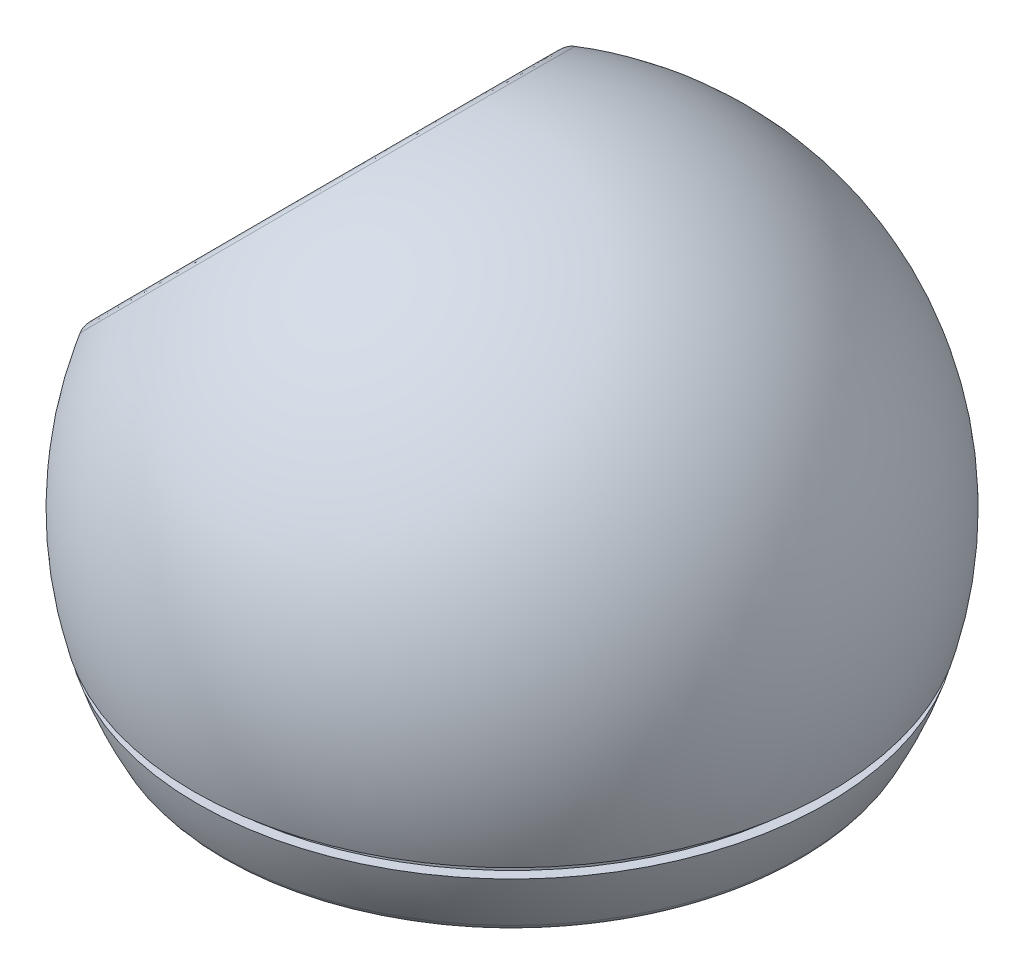
ISO-10303-21;
HEADER;
FILE_DESCRIPTION(('STEP AP214'),'2;1');
FILE_NAME('part.step','',(''),(''),'','','');
FILE_SCHEMA(('AUTOMOTIVE_DESIGN { 1 0 10303 214 1 1 1 1 }'));
ENDSEC;
DATA;
#1=APPLICATION_CONTEXT('core data for automotive mechanical design processes');
#2=APPLICATION_PROTOCOL_DEFINITION('international standard','automotive_design',2000,#1);
#3=PRODUCT_CONTEXT('',#1,'mechanical');
#4=PRODUCT('Part','Part','',(#3));
#5=PRODUCT_RELATED_PRODUCT_CATEGORY('part','',(#4));
#6=PRODUCT_DEFINITION_FORMATION('','',#4);
#7=PRODUCT_DEFINITION_CONTEXT('part definition',#1,'design');
#8=PRODUCT_DEFINITION('design','',#6,#7);
#9=PRODUCT_DEFINITION_SHAPE('','',#8);
#10=(LENGTH_UNIT() NAMED_UNIT(*) SI_UNIT(.MILLI.,.METRE.));
#11=(NAMED_UNIT(*) PLANE_ANGLE_UNIT() SI_UNIT($,.RADIAN.));
#12=(NAMED_UNIT(*) SI_UNIT($,.STERADIAN.) SOLID_ANGLE_UNIT());
#13=UNCERTAINTY_MEASURE_WITH_UNIT(LENGTH_MEASURE(1.E-05),#10,'distance_accuracy_value','');
#14=(GEOMETRIC_REPRESENTATION_CONTEXT(3) GLOBAL_UNCERTAINTY_ASSIGNED_CONTEXT((#13)) GLOBAL_UNIT_ASSIGNED_CONTEXT((#10,
#11,#12)) REPRESENTATION_CONTEXT('',''));
#15=CARTESIAN_POINT('',(0.,0.,0.));
#16=DIRECTION('',(0.,0.,1.));
#17=DIRECTION('',(1.,0.,0.));
#18=AXIS2_PLACEMENT_3D('',#15,#16,#17);
#19=CARTESIAN_POINT('',(0.,0.,0.));
#20=DIRECTION('',(0.,-1.,0.));
#21=DIRECTION('',(0.,0.,1.));
#22=AXIS2_PLACEMENT_3D('',#19,#20,#21);
#23=SPHERICAL_SURFACE('',#22,40.);
#24=CARTESIAN_POINT('',(-22.3808982234212,22.2782335526715,0.));
#25=DIRECTION('',(0.708730441300506,-0.705479384230319,0.));
#26=DIRECTION('',(0.705479384230319,0.708730441300506,0.));
#27=AXIS2_PLACEMENT_3D('',#24,#25,#26);
#28=CIRCLE('',#27,24.5514908811152);
#29=CARTESIAN_POINT('',(-5.06032755467576,39.6786225194296,0.));
#30=VERTEX_POINT('',#29);
#31=EDGE_CURVE('E282',#30,#30,#28,.T.);
#32=ORIENTED_EDGE('',*,*,#31,.T.);
#33=EDGE_LOOP('',(#32));
#34=FACE_BOUND('',#33,.T.);
#35=CARTESIAN_POINT('',(0.,-10.5,0.));
#36=DIRECTION('',(0.,-1.,0.));
#37=DIRECTION('',(0.,0.,-1.));
#38=AXIS2_PLACEMENT_3D('',#35,#36,#37);
#39=CIRCLE('',#38,38.5972796968906);
#40=CARTESIAN_POINT('',(0.,-10.5,-38.5972796968906));
#41=VERTEX_POINT('',#40);
#42=EDGE_CURVE('E304',#41,#41,#39,.T.);
#43=ORIENTED_EDGE('',*,*,#42,.F.);
#44=EDGE_LOOP('',(#43));
#45=FACE_BOUND('',#44,.T.);
#46=ADVANCED_FACE('F42',(#34,#45),#23,.T.);
#47=CARTESIAN_POINT('',(-40.2644016037276,4.90915596545674,-40.));
#48=DIRECTION('',(0.708730441300506,-0.705479384230319,0.));
#49=DIRECTION('',(0.705479384230319,0.708730441300506,0.));
#50=AXIS2_PLACEMENT_3D('',#47,#48,#49);
#51=PLANE('',#50);
#52=CARTESIAN_POINT('',(-22.6793141948512,22.5752806434986,0.));
#53=DIRECTION('',(0.708730441300506,-0.705479384230319,0.));
#54=DIRECTION('',(0.705479384230319,0.708730441300506,0.));
#55=AXIS2_PLACEMENT_3D('',#52,#53,#54);
#56=CIRCLE('',#55,23.3239163370594);
#57=CARTESIAN_POINT('',(-6.224772059543,39.1056501619188,0.));
#58=VERTEX_POINT('',#57);
#59=EDGE_CURVE('E298',#58,#58,#56,.F.);
#60=ORIENTED_EDGE('',*,*,#59,.T.);
#61=EDGE_LOOP('',(#60));
#62=FACE_BOUND('',#61,.T.);
#63=CARTESIAN_POINT('',(-36.7889018794576,8.40067181748844,-6.));
#64=DIRECTION('',(-0.708730441300506,0.705479384230319,0.));
#65=DIRECTION('',(-0.705479384230319,-0.708730441300506,0.));
#66=AXIS2_PLACEMENT_3D('',#63,#64,#65);
#67=CIRCLE('',#66,1.);
#68=CARTESIAN_POINT('',(-37.4943812636879,7.69194137618793,-6.));
#69=VERTEX_POINT('',#68);
#70=EDGE_CURVE('E307',#69,#69,#67,.T.);
#71=ORIENTED_EDGE('',*,*,#70,.F.);
#72=EDGE_LOOP('',(#71));
#73=FACE_BOUND('',#72,.T.);
#74=CARTESIAN_POINT('',(-36.7889018794575,8.40067181748845,-3.));
#75=DIRECTION('',(-0.708730441300506,0.705479384230319,0.));
#76=DIRECTION('',(-0.705479384230319,-0.708730441300506,0.));
#77=AXIS2_PLACEMENT_3D('',#74,#75,#76);
#78=CIRCLE('',#77,1.);
#79=CARTESIAN_POINT('',(-37.4943812636879,7.69194137618795,-3.));
#80=VERTEX_POINT('',#79);
#81=EDGE_CURVE('E361',#80,#80,#78,.T.);
#82=ORIENTED_EDGE('',*,*,#81,.F.);
#83=EDGE_LOOP('',(#82));
#84=FACE_BOUND('',#83,.T.);
#85=CARTESIAN_POINT('',(-36.7889018794575,8.40067181748847,6.));
#86=DIRECTION('',(-0.708730441300506,0.705479384230319,0.));
#87=DIRECTION('',(-0.705479384230319,-0.708730441300506,0.));
#88=AXIS2_PLACEMENT_3D('',#85,#86,#87);
#89=CIRCLE('',#88,1.);
#90=CARTESIAN_POINT('',(-37.4943812636878,7.69194137618796,6.));
#91=VERTEX_POINT('',#90);
#92=EDGE_CURVE('E365',#91,#91,#89,.T.);
#93=ORIENTED_EDGE('',*,*,#92,.F.);
#94=EDGE_LOOP('',(#93));
#95=FACE_BOUND('',#94,.T.);
#96=CARTESIAN_POINT('',(-36.7889018794575,8.40067181748847,3.));
#97=DIRECTION('',(-0.708730441300506,0.705479384230319,0.));
#98=DIRECTION('',(-0.705479384230319,-0.708730441300506,0.));
#99=AXIS2_PLACEMENT_3D('',#96,#97,#98);
#100=CIRCLE('',#99,1.);
#101=CARTESIAN_POINT('',(-37.4943812636878,7.69194137618796,3.));
#102=VERTEX_POINT('',#101);
#103=EDGE_CURVE('E369',#102,#102,#100,.T.);
#104=ORIENTED_EDGE('',*,*,#103,.F.);
#105=EDGE_LOOP('',(#104));
#106=FACE_BOUND('',#105,.T.);
#107=CARTESIAN_POINT('',(-36.7889018794575,8.40067181748847,0.));
#108=DIRECTION('',(-0.708730441300506,0.705479384230319,0.));
#109=DIRECTION('',(-0.705479384230319,-0.708730441300506,0.));
#110=AXIS2_PLACEMENT_3D('',#107,#108,#109);
#111=CIRCLE('',#110,1.);
#112=CARTESIAN_POINT('',(-37.4943812636878,7.69194137618796,0.));
#113=VERTEX_POINT('',#112);
#114=EDGE_CURVE('E188',#113,#113,#111,.T.);
#115=ORIENTED_EDGE('',*,*,#114,.F.);
#116=EDGE_LOOP('',(#115));
#117=FACE_BOUND('',#116,.T.);
#118=DIRECTION('',(0.,0.,-1.));
#119=VECTOR('',#118,1.);
#120=CARTESIAN_POINT('',(-10.5450687860897,34.7654442338673,-9.19999999999996));
#121=LINE('',#120,#119);
#122=CARTESIAN_POINT('',(-10.5450687860897,34.7654442338673,9.19999999999996));
#123=VERTEX_POINT('',#122);
#124=CARTESIAN_POINT('',(-10.5450687860897,34.7654442338673,-9.19999999999996));
#125=VERTEX_POINT('',#124);
#126=EDGE_CURVE('E260',#123,#125,#121,.T.);
#127=ORIENTED_EDGE('',*,*,#126,.F.);
#128=CARTESIAN_POINT('',(-14.7779450914716,30.5130615860642,9.2));
#129=DIRECTION('',(-0.708730441300506,0.705479384230319,0.));
#130=DIRECTION('',(0.705479384230319,0.708730441300506,0.));
#131=AXIS2_PLACEMENT_3D('',#128,#129,#130);
#132=CIRCLE('',#131,6.);
#133=CARTESIAN_POINT('',(-14.7779450914716,30.5130615860642,15.2));
#134=VERTEX_POINT('',#133);
#135=EDGE_CURVE('E57',#134,#123,#132,.T.);
#136=ORIENTED_EDGE('',*,*,#135,.F.);
#137=DIRECTION('',(0.705479384230319,0.708730441300506,0.));
#138=VECTOR('',#137,1.);
#139=CARTESIAN_POINT('',(-14.7779450914716,30.5130615860642,15.2));
#140=LINE('',#139,#138);
#141=CARTESIAN_POINT('',(-30.5806832982307,14.6374997009329,15.2));
#142=VERTEX_POINT('',#141);
#143=EDGE_CURVE('E237',#142,#134,#140,.T.);
#144=ORIENTED_EDGE('',*,*,#143,.F.);
#145=CARTESIAN_POINT('',(-30.5806832982307,14.6374997009329,9.2));
#146=DIRECTION('',(-0.708730441300506,0.705479384230319,0.));
#147=DIRECTION('',(-0.705479384230319,-0.708730441300506,0.));
#148=AXIS2_PLACEMENT_3D('',#145,#146,#147);
#149=CIRCLE('',#148,6.);
#150=CARTESIAN_POINT('',(-34.8135596036126,10.3851170531299,9.19999999999996));
#151=VERTEX_POINT('',#150);
#152=EDGE_CURVE('E275',#151,#142,#149,.T.);
#153=ORIENTED_EDGE('',*,*,#152,.F.);
#154=DIRECTION('',(0.,0.,1.));
#155=VECTOR('',#154,1.);
#156=CARTESIAN_POINT('',(-34.8135596036126,10.3851170531299,-9.19999999999997));
#157=LINE('',#156,#155);
#158=CARTESIAN_POINT('',(-34.8135596036126,10.3851170531299,-9.2));
#159=VERTEX_POINT('',#158);
#160=EDGE_CURVE('E272',#159,#151,#157,.T.);
#161=ORIENTED_EDGE('',*,*,#160,.F.);
#162=CARTESIAN_POINT('',(-30.5806832982307,14.6374997009329,-9.2));
#163=DIRECTION('',(-0.708730441300506,0.705479384230319,0.));
#164=DIRECTION('',(-0.705479384230319,-0.708730441300506,0.));
#165=AXIS2_PLACEMENT_3D('',#162,#163,#164);
#166=CIRCLE('',#165,6.);
#167=CARTESIAN_POINT('',(-30.5806832982307,14.637499700933,-15.2));
#168=VERTEX_POINT('',#167);
#169=EDGE_CURVE('E269',#168,#159,#166,.T.);
#170=ORIENTED_EDGE('',*,*,#169,.F.);
#171=DIRECTION('',(-0.705479384230319,-0.708730441300506,0.));
#172=VECTOR('',#171,1.);
#173=CARTESIAN_POINT('',(-14.7779450914716,30.5130615860642,-15.2));
#174=LINE('',#173,#172);
#175=CARTESIAN_POINT('',(-14.7779450914716,30.5130615860642,-15.2));
#176=VERTEX_POINT('',#175);
#177=EDGE_CURVE('E266',#176,#168,#174,.T.);
#178=ORIENTED_EDGE('',*,*,#177,.F.);
#179=CARTESIAN_POINT('',(-14.7779450914716,30.5130615860642,-9.2));
#180=DIRECTION('',(-0.708730441300506,0.705479384230319,0.));
#181=DIRECTION('',(-0.705479384230319,-0.708730441300506,0.));
#182=AXIS2_PLACEMENT_3D('',#179,#180,#181);
#183=CIRCLE('',#182,6.);
#184=EDGE_CURVE('E263',#125,#176,#183,.T.);
#185=ORIENTED_EDGE('',*,*,#184,.F.);
#186=EDGE_LOOP('',(#127,#136,#144,#153,#161,#170,#178,#185));
#187=FACE_BOUND('',#186,.T.);
#188=ADVANCED_FACE('F324',(#62,#73,#84,#95,#106,#117,#187),#51,.F.);
#189=CARTESIAN_POINT('',(-14.0692146501711,29.8075822018339,9.2));
#190=DIRECTION('',(-0.708730441300506,0.705479384230319,0.));
#191=DIRECTION('',(-0.705479384230319,-0.708730441300506,0.));
#192=AXIS2_PLACEMENT_3D('',#189,#190,#191);
#193=CYLINDRICAL_SURFACE('',#192,6.);
#194=ORIENTED_EDGE('',*,*,#135,.T.);
#195=DIRECTION('',(-0.708730441300506,0.705479384230319,0.));
#196=VECTOR('',#195,1.);
#197=CARTESIAN_POINT('',(-9.83633834478917,34.059964849637,9.19999999999996));
#198=LINE('',#197,#196);
#199=CARTESIAN_POINT('',(-9.83633834478917,34.059964849637,9.19999999999996));
#200=VERTEX_POINT('',#199);
#201=EDGE_CURVE('E258',#200,#123,#198,.T.);
#202=ORIENTED_EDGE('',*,*,#201,.F.);
#203=CARTESIAN_POINT('',(-14.0692146501711,29.8075822018339,9.2));
#204=DIRECTION('',(-0.708730441300506,0.705479384230319,0.));
#205=DIRECTION('',(0.705479384230319,0.708730441300506,0.));
#206=AXIS2_PLACEMENT_3D('',#203,#204,#205);
#207=CIRCLE('',#206,6.);
#208=CARTESIAN_POINT('',(-14.0692146501711,29.8075822018339,15.2));
#209=VERTEX_POINT('',#208);
#210=EDGE_CURVE('E233',#209,#200,#207,.T.);
#211=ORIENTED_EDGE('',*,*,#210,.F.);
#212=DIRECTION('',(-0.708730441300506,0.705479384230319,0.));
#213=VECTOR('',#212,1.);
#214=CARTESIAN_POINT('',(-14.0692146501711,29.8075822018339,15.2));
#215=LINE('',#214,#213);
#216=EDGE_CURVE('E280',#209,#134,#215,.T.);
#217=ORIENTED_EDGE('',*,*,#216,.T.);
#218=EDGE_LOOP('',(#194,#202,#211,#217));
#219=FACE_BOUND('',#218,.T.);
#220=ADVANCED_FACE('F329',(#219),#193,.F.);
#221=CARTESIAN_POINT('',(-14.0692146501711,29.8075822018339,15.2));
#222=DIRECTION('',(0.,0.,1.));
#223=DIRECTION('',(1.,0.,0.));
#224=AXIS2_PLACEMENT_3D('',#221,#222,#223);
#225=PLANE('',#224);
#226=ORIENTED_EDGE('',*,*,#143,.T.);
#227=ORIENTED_EDGE('',*,*,#216,.F.);
#228=DIRECTION('',(0.705479384230319,0.708730441300506,0.));
#229=VECTOR('',#228,1.);
#230=CARTESIAN_POINT('',(-14.0692146501711,29.8075822018339,15.2));
#231=LINE('',#230,#229);
#232=CARTESIAN_POINT('',(-29.8719528569302,13.9320203167026,15.2));
#233=VERTEX_POINT('',#232);
#234=EDGE_CURVE('E255',#233,#209,#231,.T.);
#235=ORIENTED_EDGE('',*,*,#234,.F.);
#236=DIRECTION('',(-0.708730441300506,0.705479384230319,0.));
#237=VECTOR('',#236,1.);
#238=CARTESIAN_POINT('',(-29.8719528569302,13.9320203167026,15.2));
#239=LINE('',#238,#237);
#240=EDGE_CURVE('E283',#233,#142,#239,.T.);
#241=ORIENTED_EDGE('',*,*,#240,.T.);
#242=EDGE_LOOP('',(#226,#227,#235,#241));
#243=FACE_BOUND('',#242,.T.);
#244=ADVANCED_FACE('F385',(#243),#225,.F.);
#245=CARTESIAN_POINT('',(-29.8719528569302,13.9320203167026,9.2));
#246=DIRECTION('',(-0.708730441300506,0.705479384230319,0.));
#247=DIRECTION('',(-0.705479384230319,-0.708730441300506,0.));
#248=AXIS2_PLACEMENT_3D('',#245,#246,#247);
#249=CYLINDRICAL_SURFACE('',#248,6.);
#250=ORIENTED_EDGE('',*,*,#152,.T.);
#251=ORIENTED_EDGE('',*,*,#240,.F.);
#252=CARTESIAN_POINT('',(-29.8719528569302,13.9320203167026,9.2));
#253=DIRECTION('',(-0.708730441300506,0.705479384230319,0.));
#254=DIRECTION('',(-0.705479384230319,-0.708730441300506,0.));
#255=AXIS2_PLACEMENT_3D('',#252,#253,#254);
#256=CIRCLE('',#255,6.);
#257=CARTESIAN_POINT('',(-34.1048291623121,9.67963766889957,9.19999999999996));
#258=VERTEX_POINT('',#257);
#259=EDGE_CURVE('E252',#258,#233,#256,.T.);
#260=ORIENTED_EDGE('',*,*,#259,.F.);
#261=DIRECTION('',(-0.708730441300506,0.705479384230319,0.));
#262=VECTOR('',#261,1.);
#263=CARTESIAN_POINT('',(-34.1048291623121,9.67963766889957,9.19999999999996));
#264=LINE('',#263,#262);
#265=EDGE_CURVE('E285',#258,#151,#264,.T.);
#266=ORIENTED_EDGE('',*,*,#265,.T.);
#267=EDGE_LOOP('',(#250,#251,#260,#266));
#268=FACE_BOUND('',#267,.T.);
#269=ADVANCED_FACE('F390',(#268),#249,.F.);
#270=CARTESIAN_POINT('',(-34.1048291623121,9.67963766889957,-9.19999999999997));
#271=DIRECTION('',(-0.705479384230319,-0.708730441300506,0.));
#272=DIRECTION('',(0.708730441300506,-0.705479384230319,0.));
#273=AXIS2_PLACEMENT_3D('',#270,#271,#272);
#274=PLANE('',#273);
#275=ORIENTED_EDGE('',*,*,#160,.T.);
#276=ORIENTED_EDGE('',*,*,#265,.F.);
#277=DIRECTION('',(0.,0.,1.));
#278=VECTOR('',#277,1.);
#279=CARTESIAN_POINT('',(-34.1048291623121,9.67963766889957,-9.19999999999997));
#280=LINE('',#279,#278);
#281=CARTESIAN_POINT('',(-34.1048291623121,9.67963766889956,-9.2));
#282=VERTEX_POINT('',#281);
#283=EDGE_CURVE('E249',#282,#258,#280,.T.);
#284=ORIENTED_EDGE('',*,*,#283,.F.);
#285=DIRECTION('',(-0.708730441300506,0.705479384230319,0.));
#286=VECTOR('',#285,1.);
#287=CARTESIAN_POINT('',(-34.1048291623121,9.67963766889956,-9.2));
#288=LINE('',#287,#286);
#289=EDGE_CURVE('E287',#282,#159,#288,.T.);
#290=ORIENTED_EDGE('',*,*,#289,.T.);
#291=EDGE_LOOP('',(#275,#276,#284,#290));
#292=FACE_BOUND('',#291,.T.);
#293=ADVANCED_FACE('F393',(#292),#274,.F.);
#294=CARTESIAN_POINT('',(-29.8719528569302,13.9320203167026,-9.2));
#295=DIRECTION('',(-0.708730441300506,0.705479384230319,0.));
#296=DIRECTION('',(-0.705479384230319,-0.708730441300506,0.));
#297=AXIS2_PLACEMENT_3D('',#294,#295,#296);
#298=CYLINDRICAL_SURFACE('',#297,6.);
#299=ORIENTED_EDGE('',*,*,#169,.T.);
#300=ORIENTED_EDGE('',*,*,#289,.F.);
#301=CARTESIAN_POINT('',(-29.8719528569302,13.9320203167026,-9.2));
#302=DIRECTION('',(-0.708730441300506,0.705479384230319,0.));
#303=DIRECTION('',(-0.705479384230319,-0.708730441300506,0.));
#304=AXIS2_PLACEMENT_3D('',#301,#302,#303);
#305=CIRCLE('',#304,6.);
#306=CARTESIAN_POINT('',(-29.8719528569302,13.9320203167026,-15.2));
#307=VERTEX_POINT('',#306);
#308=EDGE_CURVE('E246',#307,#282,#305,.T.);
#309=ORIENTED_EDGE('',*,*,#308,.F.);
#310=DIRECTION('',(-0.708730441300506,0.705479384230319,0.));
#311=VECTOR('',#310,1.);
#312=CARTESIAN_POINT('',(-29.8719528569302,13.9320203167026,-15.2));
#313=LINE('',#312,#311);
#314=EDGE_CURVE('E289',#307,#168,#313,.T.);
#315=ORIENTED_EDGE('',*,*,#314,.T.);
#316=EDGE_LOOP('',(#299,#300,#309,#315));
#317=FACE_BOUND('',#316,.T.);
#318=ADVANCED_FACE('F396',(#317),#298,.F.);
#319=CARTESIAN_POINT('',(-14.0692146501711,29.8075822018339,-15.2));
#320=DIRECTION('',(0.,0.,-1.));
#321=DIRECTION('',(-1.,0.,0.));
#322=AXIS2_PLACEMENT_3D('',#319,#320,#321);
#323=PLANE('',#322);
#324=ORIENTED_EDGE('',*,*,#177,.T.);
#325=ORIENTED_EDGE('',*,*,#314,.F.);
#326=DIRECTION('',(-0.705479384230319,-0.708730441300506,0.));
#327=VECTOR('',#326,1.);
#328=CARTESIAN_POINT('',(-14.0692146501711,29.8075822018339,-15.2));
#329=LINE('',#328,#327);
#330=CARTESIAN_POINT('',(-14.0692146501711,29.8075822018339,-15.2));
#331=VERTEX_POINT('',#330);
#332=EDGE_CURVE('E243',#331,#307,#329,.T.);
#333=ORIENTED_EDGE('',*,*,#332,.F.);
#334=DIRECTION('',(-0.708730441300506,0.705479384230319,0.));
#335=VECTOR('',#334,1.);
#336=CARTESIAN_POINT('',(-14.0692146501711,29.8075822018339,-15.2));
#337=LINE('',#336,#335);
#338=EDGE_CURVE('E291',#331,#176,#337,.T.);
#339=ORIENTED_EDGE('',*,*,#338,.T.);
#340=EDGE_LOOP('',(#324,#325,#333,#339));
#341=FACE_BOUND('',#340,.T.);
#342=ADVANCED_FACE('F398',(#341),#323,.F.);
#343=CARTESIAN_POINT('',(-14.0692146501711,29.8075822018339,-9.2));
#344=DIRECTION('',(-0.708730441300506,0.705479384230319,0.));
#345=DIRECTION('',(-0.705479384230319,-0.708730441300506,0.));
#346=AXIS2_PLACEMENT_3D('',#343,#344,#345);
#347=CYLINDRICAL_SURFACE('',#346,6.);
#348=ORIENTED_EDGE('',*,*,#184,.T.);
#349=ORIENTED_EDGE('',*,*,#338,.F.);
#350=CARTESIAN_POINT('',(-14.0692146501711,29.8075822018339,-9.2));
#351=DIRECTION('',(-0.708730441300506,0.705479384230319,0.));
#352=DIRECTION('',(-0.705479384230319,-0.708730441300506,0.));
#353=AXIS2_PLACEMENT_3D('',#350,#351,#352);
#354=CIRCLE('',#353,6.);
#355=CARTESIAN_POINT('',(-9.83633834478917,34.059964849637,-9.19999999999996));
#356=VERTEX_POINT('',#355);
#357=EDGE_CURVE('E240',#356,#331,#354,.T.);
#358=ORIENTED_EDGE('',*,*,#357,.F.);
#359=DIRECTION('',(-0.708730441300506,0.705479384230319,0.));
#360=VECTOR('',#359,1.);
#361=CARTESIAN_POINT('',(-9.83633834478917,34.059964849637,-9.19999999999996));
#362=LINE('',#361,#360);
#363=EDGE_CURVE('E293',#356,#125,#362,.T.);
#364=ORIENTED_EDGE('',*,*,#363,.T.);
#365=EDGE_LOOP('',(#348,#349,#358,#364));
#366=FACE_BOUND('',#365,.T.);
#367=ADVANCED_FACE('F401',(#366),#347,.F.);
#368=CARTESIAN_POINT('',(-9.83633834478917,34.059964849637,-9.19999999999996));
#369=DIRECTION('',(0.705479384230319,0.708730441300506,0.));
#370=DIRECTION('',(-0.708730441300506,0.705479384230319,0.));
#371=AXIS2_PLACEMENT_3D('',#368,#369,#370);
#372=PLANE('',#371);
#373=ORIENTED_EDGE('',*,*,#126,.T.);
#374=ORIENTED_EDGE('',*,*,#363,.F.);
#375=DIRECTION('',(0.,0.,-1.));
#376=VECTOR('',#375,1.);
#377=CARTESIAN_POINT('',(-9.83633834478917,34.059964849637,-9.19999999999996));
#378=LINE('',#377,#376);
#379=EDGE_CURVE('E236',#200,#356,#378,.T.);
#380=ORIENTED_EDGE('',*,*,#379,.F.);
#381=ORIENTED_EDGE('',*,*,#201,.T.);
#382=EDGE_LOOP('',(#373,#374,#380,#381));
#383=FACE_BOUND('',#382,.T.);
#384=ADVANCED_FACE('F378',(#383),#372,.F.);
#385=CARTESIAN_POINT('',(-14.0692146501711,29.8075822018339,9.2));
#386=DIRECTION('',(0.708730441300506,-0.705479384230319,0.));
#387=DIRECTION('',(0.705479384230319,0.708730441300506,0.));
#388=AXIS2_PLACEMENT_3D('',#385,#386,#387);
#389=PLANE('',#388);
#390=CARTESIAN_POINT('',(-29.8719528569302,13.9320203167026,9.2));
#391=DIRECTION('',(-0.708730441300506,0.705479384230319,0.));
#392=DIRECTION('',(-0.705479384230319,-0.708730441300506,0.));
#393=AXIS2_PLACEMENT_3D('',#390,#391,#392);
#394=CIRCLE('',#393,5.);
#395=CARTESIAN_POINT('',(-33.3993497780818,10.3883681102001,9.19999999999997));
#396=VERTEX_POINT('',#395);
#397=CARTESIAN_POINT('',(-29.8719528569302,13.9320203167026,14.2));
#398=VERTEX_POINT('',#397);
#399=EDGE_CURVE('E174',#396,#398,#394,.T.);
#400=ORIENTED_EDGE('',*,*,#399,.F.);
#401=DIRECTION('',(0.,0.,1.));
#402=VECTOR('',#401,1.);
#403=CARTESIAN_POINT('',(-33.3993497780818,10.3883681102001,-9.19999999999997));
#404=LINE('',#403,#402);
#405=CARTESIAN_POINT('',(-33.3993497780818,10.3883681102001,-9.19999999999997));
#406=VERTEX_POINT('',#405);
#407=EDGE_CURVE('E167',#406,#396,#404,.T.);
#408=ORIENTED_EDGE('',*,*,#407,.F.);
#409=CARTESIAN_POINT('',(-29.8719528569302,13.9320203167026,-9.2));
#410=DIRECTION('',(-0.708730441300506,0.705479384230319,0.));
#411=DIRECTION('',(-0.705479384230319,-0.708730441300506,0.));
#412=AXIS2_PLACEMENT_3D('',#409,#410,#411);
#413=CIRCLE('',#412,5.);
#414=CARTESIAN_POINT('',(-29.8719528569302,13.9320203167026,-14.2));
#415=VERTEX_POINT('',#414);
#416=EDGE_CURVE('E201',#415,#406,#413,.T.);
#417=ORIENTED_EDGE('',*,*,#416,.F.);
#418=DIRECTION('',(-0.705479384230319,-0.708730441300506,0.));
#419=VECTOR('',#418,1.);
#420=CARTESIAN_POINT('',(-14.0692146501711,29.8075822018339,-14.2));
#421=LINE('',#420,#419);
#422=CARTESIAN_POINT('',(-14.0692146501711,29.8075822018339,-14.2));
#423=VERTEX_POINT('',#422);
#424=EDGE_CURVE('E198',#423,#415,#421,.T.);
#425=ORIENTED_EDGE('',*,*,#424,.F.);
#426=CARTESIAN_POINT('',(-14.0692146501711,29.8075822018339,-9.2));
#427=DIRECTION('',(-0.708730441300506,0.705479384230319,0.));
#428=DIRECTION('',(-0.705479384230319,-0.708730441300506,0.));
#429=AXIS2_PLACEMENT_3D('',#426,#427,#428);
#430=CIRCLE('',#429,5.);
#431=CARTESIAN_POINT('',(-10.5418177290195,33.3512344083365,-9.19999999999997));
#432=VERTEX_POINT('',#431);
#433=EDGE_CURVE('E195',#432,#423,#430,.T.);
#434=ORIENTED_EDGE('',*,*,#433,.F.);
#435=DIRECTION('',(0.,0.,-1.));
#436=VECTOR('',#435,1.);
#437=CARTESIAN_POINT('',(-10.5418177290195,33.3512344083365,-9.19999999999997));
#438=LINE('',#437,#436);
#439=CARTESIAN_POINT('',(-10.5418177290195,33.3512344083365,9.19999999999997));
#440=VERTEX_POINT('',#439);
#441=EDGE_CURVE('E192',#440,#432,#438,.T.);
#442=ORIENTED_EDGE('',*,*,#441,.F.);
#443=CARTESIAN_POINT('',(-14.0692146501711,29.8075822018339,9.2));
#444=DIRECTION('',(-0.708730441300506,0.705479384230319,0.));
#445=DIRECTION('',(0.705479384230319,0.708730441300506,0.));
#446=AXIS2_PLACEMENT_3D('',#443,#444,#445);
#447=CIRCLE('',#446,5.);
#448=CARTESIAN_POINT('',(-14.0692146501711,29.8075822018339,14.2));
#449=VERTEX_POINT('',#448);
#450=EDGE_CURVE('E178',#449,#440,#447,.T.);
#451=ORIENTED_EDGE('',*,*,#450,.F.);
#452=DIRECTION('',(0.705479384230319,0.708730441300506,0.));
#453=VECTOR('',#452,1.);
#454=CARTESIAN_POINT('',(-14.0692146501711,29.8075822018339,14.2));
#455=LINE('',#454,#453);
#456=EDGE_CURVE('E159',#398,#449,#455,.T.);
#457=ORIENTED_EDGE('',*,*,#456,.F.);
#458=EDGE_LOOP('',(#400,#408,#417,#425,#434,#442,#451,#457));
#459=FACE_BOUND('',#458,.T.);
#460=ORIENTED_EDGE('',*,*,#210,.T.);
#461=ORIENTED_EDGE('',*,*,#379,.T.);
#462=ORIENTED_EDGE('',*,*,#357,.T.);
#463=ORIENTED_EDGE('',*,*,#332,.T.);
#464=ORIENTED_EDGE('',*,*,#308,.T.);
#465=ORIENTED_EDGE('',*,*,#283,.T.);
#466=ORIENTED_EDGE('',*,*,#259,.T.);
#467=ORIENTED_EDGE('',*,*,#234,.T.);
#468=EDGE_LOOP('',(#460,#461,#462,#463,#464,#465,#466,#467));
#469=FACE_BOUND('',#468,.T.);
#470=ADVANCED_FACE('F171',(#459,#469),#389,.F.);
#471=CARTESIAN_POINT('',(-29.8719528569302,13.9320203167026,9.2));
#472=DIRECTION('',(-0.708730441300506,0.705479384230319,0.));
#473=DIRECTION('',(-0.705479384230319,-0.708730441300506,0.));
#474=AXIS2_PLACEMENT_3D('',#471,#472,#473);
#475=CYLINDRICAL_SURFACE('',#474,5.);
#476=CARTESIAN_POINT('',(-30.5806832982307,14.6374997009329,9.2));
#477=DIRECTION('',(-0.708730441300506,0.705479384230319,0.));
#478=DIRECTION('',(-0.705479384230319,-0.708730441300506,0.));
#479=AXIS2_PLACEMENT_3D('',#476,#477,#478);
#480=CIRCLE('',#479,5.);
#481=CARTESIAN_POINT('',(-34.1080802193823,11.0938474944304,9.19999999999997));
#482=VERTEX_POINT('',#481);
#483=CARTESIAN_POINT('',(-30.5806832982307,14.6374997009329,14.2));
#484=VERTEX_POINT('',#483);
#485=EDGE_CURVE('E205',#482,#484,#480,.T.);
#486=ORIENTED_EDGE('',*,*,#485,.F.);
#487=DIRECTION('',(-0.708730441300506,0.705479384230319,0.));
#488=VECTOR('',#487,1.);
#489=CARTESIAN_POINT('',(-33.3993497780818,10.3883681102001,9.19999999999997));
#490=LINE('',#489,#488);
#491=EDGE_CURVE('E181',#396,#482,#490,.T.);
#492=ORIENTED_EDGE('',*,*,#491,.F.);
#493=ORIENTED_EDGE('',*,*,#399,.T.);
#494=DIRECTION('',(-0.708730441300506,0.705479384230319,0.));
#495=VECTOR('',#494,1.);
#496=CARTESIAN_POINT('',(-29.8719528569302,13.9320203167026,14.2));
#497=LINE('',#496,#495);
#498=EDGE_CURVE('E156',#398,#484,#497,.T.);
#499=ORIENTED_EDGE('',*,*,#498,.T.);
#500=EDGE_LOOP('',(#486,#492,#493,#499));
#501=FACE_BOUND('',#500,.T.);
#502=ADVANCED_FACE('F180',(#501),#475,.T.);
#503=CARTESIAN_POINT('',(-33.3993497780818,10.3883681102001,-9.19999999999997));
#504=DIRECTION('',(-0.705479384230319,-0.708730441300506,0.));
#505=DIRECTION('',(0.708730441300506,-0.705479384230319,0.));
#506=AXIS2_PLACEMENT_3D('',#503,#504,#505);
#507=PLANE('',#506);
#508=DIRECTION('',(0.,0.,1.));
#509=VECTOR('',#508,1.);
#510=CARTESIAN_POINT('',(-34.1080802193823,11.0938474944304,-9.19999999999997));
#511=LINE('',#510,#509);
#512=CARTESIAN_POINT('',(-34.1080802193823,11.0938474944304,-9.19999999999997));
#513=VERTEX_POINT('',#512);
#514=EDGE_CURVE('E182',#513,#482,#511,.T.);
#515=ORIENTED_EDGE('',*,*,#514,.F.);
#516=DIRECTION('',(-0.708730441300506,0.705479384230319,0.));
#517=VECTOR('',#516,1.);
#518=CARTESIAN_POINT('',(-33.3993497780818,10.3883681102001,-9.19999999999997));
#519=LINE('',#518,#517);
#520=EDGE_CURVE('E222',#406,#513,#519,.T.);
#521=ORIENTED_EDGE('',*,*,#520,.F.);
#522=ORIENTED_EDGE('',*,*,#407,.T.);
#523=ORIENTED_EDGE('',*,*,#491,.T.);
#524=EDGE_LOOP('',(#515,#521,#522,#523));
#525=FACE_BOUND('',#524,.T.);
#526=ADVANCED_FACE('F459',(#525),#507,.T.);
#527=CARTESIAN_POINT('',(-29.8719528569302,13.9320203167026,-9.2));
#528=DIRECTION('',(-0.708730441300506,0.705479384230319,0.));
#529=DIRECTION('',(-0.705479384230319,-0.708730441300506,0.));
#530=AXIS2_PLACEMENT_3D('',#527,#528,#529);
#531=CYLINDRICAL_SURFACE('',#530,5.);
#532=CARTESIAN_POINT('',(-30.5806832982307,14.6374997009329,-9.2));
#533=DIRECTION('',(-0.708730441300506,0.705479384230319,0.));
#534=DIRECTION('',(-0.705479384230319,-0.708730441300506,0.));
#535=AXIS2_PLACEMENT_3D('',#532,#533,#534);
#536=CIRCLE('',#535,5.);
#537=CARTESIAN_POINT('',(-30.5806832982307,14.6374997009329,-14.2));
#538=VERTEX_POINT('',#537);
#539=EDGE_CURVE('E185',#538,#513,#536,.T.);
#540=ORIENTED_EDGE('',*,*,#539,.F.);
#541=DIRECTION('',(-0.708730441300506,0.705479384230319,0.));
#542=VECTOR('',#541,1.);
#543=CARTESIAN_POINT('',(-29.8719528569302,13.9320203167026,-14.2));
#544=LINE('',#543,#542);
#545=EDGE_CURVE('E224',#415,#538,#544,.T.);
#546=ORIENTED_EDGE('',*,*,#545,.F.);
#547=ORIENTED_EDGE('',*,*,#416,.T.);
#548=ORIENTED_EDGE('',*,*,#520,.T.);
#549=EDGE_LOOP('',(#540,#546,#547,#548));
#550=FACE_BOUND('',#549,.T.);
#551=ADVANCED_FACE('F465',(#550),#531,.T.);
#552=CARTESIAN_POINT('',(-14.0692146501711,29.8075822018339,-14.2));
#553=DIRECTION('',(0.,0.,-1.));
#554=DIRECTION('',(-1.,0.,0.));
#555=AXIS2_PLACEMENT_3D('',#552,#553,#554);
#556=PLANE('',#555);
#557=DIRECTION('',(-0.705479384230319,-0.708730441300506,0.));
#558=VECTOR('',#557,1.);
#559=CARTESIAN_POINT('',(-14.7779450914716,30.5130615860642,-14.2));
#560=LINE('',#559,#558);
#561=CARTESIAN_POINT('',(-14.7779450914716,30.5130615860642,-14.2));
#562=VERTEX_POINT('',#561);
#563=EDGE_CURVE('E216',#562,#538,#560,.T.);
#564=ORIENTED_EDGE('',*,*,#563,.F.);
#565=DIRECTION('',(-0.708730441300506,0.705479384230319,0.));
#566=VECTOR('',#565,1.);
#567=CARTESIAN_POINT('',(-14.0692146501711,29.8075822018339,-14.2));
#568=LINE('',#567,#566);
#569=EDGE_CURVE('E226',#423,#562,#568,.T.);
#570=ORIENTED_EDGE('',*,*,#569,.F.);
#571=ORIENTED_EDGE('',*,*,#424,.T.);
#572=ORIENTED_EDGE('',*,*,#545,.T.);
#573=EDGE_LOOP('',(#564,#570,#571,#572));
#574=FACE_BOUND('',#573,.T.);
#575=ADVANCED_FACE('F473',(#574),#556,.T.);
#576=CARTESIAN_POINT('',(-14.0692146501711,29.8075822018339,-9.2));
#577=DIRECTION('',(-0.708730441300506,0.705479384230319,0.));
#578=DIRECTION('',(-0.705479384230319,-0.708730441300506,0.));
#579=AXIS2_PLACEMENT_3D('',#576,#577,#578);
#580=CYLINDRICAL_SURFACE('',#579,5.);
#581=CARTESIAN_POINT('',(-14.7779450914716,30.5130615860642,-9.2));
#582=DIRECTION('',(-0.708730441300506,0.705479384230319,0.));
#583=DIRECTION('',(-0.705479384230319,-0.708730441300506,0.));
#584=AXIS2_PLACEMENT_3D('',#581,#582,#583);
#585=CIRCLE('',#584,5.);
#586=CARTESIAN_POINT('',(-11.25054817032,34.0567137925668,-9.19999999999997));
#587=VERTEX_POINT('',#586);
#588=EDGE_CURVE('E213',#587,#562,#585,.T.);
#589=ORIENTED_EDGE('',*,*,#588,.F.);
#590=DIRECTION('',(-0.708730441300506,0.705479384230319,0.));
#591=VECTOR('',#590,1.);
#592=CARTESIAN_POINT('',(-10.5418177290195,33.3512344083365,-9.19999999999997));
#593=LINE('',#592,#591);
#594=EDGE_CURVE('E228',#432,#587,#593,.T.);
#595=ORIENTED_EDGE('',*,*,#594,.F.);
#596=ORIENTED_EDGE('',*,*,#433,.T.);
#597=ORIENTED_EDGE('',*,*,#569,.T.);
#598=EDGE_LOOP('',(#589,#595,#596,#597));
#599=FACE_BOUND('',#598,.T.);
#600=ADVANCED_FACE('F481',(#599),#580,.T.);
#601=CARTESIAN_POINT('',(-10.5418177290195,33.3512344083365,-9.19999999999997));
#602=DIRECTION('',(0.705479384230319,0.708730441300506,0.));
#603=DIRECTION('',(-0.708730441300506,0.705479384230319,0.));
#604=AXIS2_PLACEMENT_3D('',#601,#602,#603);
#605=PLANE('',#604);
#606=DIRECTION('',(0.,0.,-1.));
#607=VECTOR('',#606,1.);
#608=CARTESIAN_POINT('',(-11.25054817032,34.0567137925668,-9.19999999999997));
#609=LINE('',#608,#607);
#610=CARTESIAN_POINT('',(-11.25054817032,34.0567137925668,9.19999999999997));
#611=VERTEX_POINT('',#610);
#612=EDGE_CURVE('E210',#611,#587,#609,.T.);
#613=ORIENTED_EDGE('',*,*,#612,.F.);
#614=DIRECTION('',(-0.708730441300506,0.705479384230319,0.));
#615=VECTOR('',#614,1.);
#616=CARTESIAN_POINT('',(-10.5418177290195,33.3512344083365,9.19999999999997));
#617=LINE('',#616,#615);
#618=EDGE_CURVE('E230',#440,#611,#617,.T.);
#619=ORIENTED_EDGE('',*,*,#618,.F.);
#620=ORIENTED_EDGE('',*,*,#441,.T.);
#621=ORIENTED_EDGE('',*,*,#594,.T.);
#622=EDGE_LOOP('',(#613,#619,#620,#621));
#623=FACE_BOUND('',#622,.T.);
#624=ADVANCED_FACE('F489',(#623),#605,.T.);
#625=CARTESIAN_POINT('',(-14.0692146501711,29.8075822018339,9.2));
#626=DIRECTION('',(-0.708730441300506,0.705479384230319,0.));
#627=DIRECTION('',(-0.705479384230319,-0.708730441300506,0.));
#628=AXIS2_PLACEMENT_3D('',#625,#626,#627);
#629=CYLINDRICAL_SURFACE('',#628,5.);
#630=CARTESIAN_POINT('',(-14.7779450914716,30.5130615860642,9.2));
#631=DIRECTION('',(-0.708730441300506,0.705479384230319,0.));
#632=DIRECTION('',(0.705479384230319,0.708730441300506,0.));
#633=AXIS2_PLACEMENT_3D('',#630,#631,#632);
#634=CIRCLE('',#633,5.);
#635=CARTESIAN_POINT('',(-14.7779450914716,30.5130615860642,14.2));
#636=VERTEX_POINT('',#635);
#637=EDGE_CURVE('E65',#636,#611,#634,.T.);
#638=ORIENTED_EDGE('',*,*,#637,.F.);
#639=DIRECTION('',(-0.708730441300506,0.705479384230319,0.));
#640=VECTOR('',#639,1.);
#641=CARTESIAN_POINT('',(-14.0692146501711,29.8075822018339,14.2));
#642=LINE('',#641,#640);
#643=EDGE_CURVE('E166',#449,#636,#642,.T.);
#644=ORIENTED_EDGE('',*,*,#643,.F.);
#645=ORIENTED_EDGE('',*,*,#450,.T.);
#646=ORIENTED_EDGE('',*,*,#618,.T.);
#647=EDGE_LOOP('',(#638,#644,#645,#646));
#648=FACE_BOUND('',#647,.T.);
#649=ADVANCED_FACE('F497',(#648),#629,.T.);
#650=CARTESIAN_POINT('',(-14.0692146501711,29.8075822018339,14.2));
#651=DIRECTION('',(0.,0.,1.));
#652=DIRECTION('',(1.,0.,0.));
#653=AXIS2_PLACEMENT_3D('',#650,#651,#652);
#654=PLANE('',#653);
#655=DIRECTION('',(0.705479384230319,0.708730441300506,0.));
#656=VECTOR('',#655,1.);
#657=CARTESIAN_POINT('',(-14.7779450914716,30.5130615860642,14.2));
#658=LINE('',#657,#656);
#659=EDGE_CURVE('E161',#484,#636,#658,.T.);
#660=ORIENTED_EDGE('',*,*,#659,.F.);
#661=ORIENTED_EDGE('',*,*,#498,.F.);
#662=ORIENTED_EDGE('',*,*,#456,.T.);
#663=ORIENTED_EDGE('',*,*,#643,.T.);
#664=EDGE_LOOP('',(#660,#661,#662,#663));
#665=FACE_BOUND('',#664,.T.);
#666=ADVANCED_FACE('F158',(#665),#654,.T.);
#667=ORIENTED_EDGE('',*,*,#485,.T.);
#668=ORIENTED_EDGE('',*,*,#659,.T.);
#669=ORIENTED_EDGE('',*,*,#637,.T.);
#670=ORIENTED_EDGE('',*,*,#612,.T.);
#671=ORIENTED_EDGE('',*,*,#588,.T.);
#672=ORIENTED_EDGE('',*,*,#563,.T.);
#673=ORIENTED_EDGE('',*,*,#539,.T.);
#674=ORIENTED_EDGE('',*,*,#514,.T.);
#675=EDGE_LOOP('',(#667,#668,#669,#670,#671,#672,#673,#674));
#676=FACE_BOUND('',#675,.T.);
#677=ADVANCED_FACE('F332',(#676),#51,.F.);
#678=CARTESIAN_POINT('',(-36.080171438157,7.69519243325815,0.));
#679=DIRECTION('',(-0.708730441300506,0.705479384230319,0.));
#680=DIRECTION('',(-0.705479384230319,-0.708730441300506,0.));
#681=AXIS2_PLACEMENT_3D('',#678,#679,#680);
#682=CYLINDRICAL_SURFACE('',#681,1.);
#683=CARTESIAN_POINT('',(-36.080171438157,7.69519243325815,0.));
#684=DIRECTION('',(-0.708730441300506,0.705479384230319,0.));
#685=DIRECTION('',(-0.705479384230319,-0.708730441300506,0.));
#686=AXIS2_PLACEMENT_3D('',#683,#684,#685);
#687=CIRCLE('',#686,1.);
#688=CARTESIAN_POINT('',(-36.7856508223873,6.98646199195764,0.));
#689=VERTEX_POINT('',#688);
#690=EDGE_CURVE('E207',#689,#689,#687,.T.);
#691=ORIENTED_EDGE('',*,*,#690,.F.);
#692=EDGE_LOOP('',(#691));
#693=FACE_BOUND('',#692,.T.);
#694=ORIENTED_EDGE('',*,*,#114,.T.);
#695=EDGE_LOOP('',(#694));
#696=FACE_BOUND('',#695,.T.);
#697=ADVANCED_FACE('F517',(#693,#696),#682,.F.);
#698=CARTESIAN_POINT('',(-36.080171438157,7.69519243325815,0.));
#699=DIRECTION('',(-0.708730441300506,0.705479384230319,0.));
#700=DIRECTION('',(-0.705479384230319,-0.708730441300506,0.));
#701=AXIS2_PLACEMENT_3D('',#698,#699,#700);
#702=PLANE('',#701);
#703=ORIENTED_EDGE('',*,*,#690,.T.);
#704=EDGE_LOOP('',(#703));
#705=FACE_BOUND('',#704,.T.);
#706=ADVANCED_FACE('F525',(#705),#702,.T.);
#707=CARTESIAN_POINT('',(-36.080171438157,7.69519243325815,3.));
#708=DIRECTION('',(-0.708730441300506,0.705479384230319,0.));
#709=DIRECTION('',(-0.705479384230319,-0.708730441300506,0.));
#710=AXIS2_PLACEMENT_3D('',#707,#708,#709);
#711=CYLINDRICAL_SURFACE('',#710,1.);
#712=CARTESIAN_POINT('',(-36.080171438157,7.69519243325815,3.));
#713=DIRECTION('',(-0.708730441300506,0.705479384230319,0.));
#714=DIRECTION('',(-0.705479384230319,-0.708730441300506,0.));
#715=AXIS2_PLACEMENT_3D('',#712,#713,#714);
#716=CIRCLE('',#715,1.);
#717=CARTESIAN_POINT('',(-36.7856508223873,6.98646199195764,3.));
#718=VERTEX_POINT('',#717);
#719=EDGE_CURVE('E749',#718,#718,#716,.T.);
#720=ORIENTED_EDGE('',*,*,#719,.F.);
#721=EDGE_LOOP('',(#720));
#722=FACE_BOUND('',#721,.T.);
#723=ORIENTED_EDGE('',*,*,#103,.T.);
#724=EDGE_LOOP('',(#723));
#725=FACE_BOUND('',#724,.T.);
#726=ADVANCED_FACE('F533',(#722,#725),#711,.F.);
#727=CARTESIAN_POINT('',(-36.080171438157,7.69519243325815,3.));
#728=DIRECTION('',(-0.708730441300506,0.705479384230319,0.));
#729=DIRECTION('',(-0.705479384230319,-0.708730441300506,0.));
#730=AXIS2_PLACEMENT_3D('',#727,#728,#729);
#731=PLANE('',#730);
#732=ORIENTED_EDGE('',*,*,#719,.T.);
#733=EDGE_LOOP('',(#732));
#734=FACE_BOUND('',#733,.T.);
#735=ADVANCED_FACE('F541',(#734),#731,.T.);
#736=CARTESIAN_POINT('',(-36.080171438157,7.69519243325815,6.));
#737=DIRECTION('',(-0.708730441300506,0.705479384230319,0.));
#738=DIRECTION('',(-0.705479384230319,-0.708730441300506,0.));
#739=AXIS2_PLACEMENT_3D('',#736,#737,#738);
#740=CYLINDRICAL_SURFACE('',#739,1.);
#741=CARTESIAN_POINT('',(-36.080171438157,7.69519243325815,6.));
#742=DIRECTION('',(-0.708730441300506,0.705479384230319,0.));
#743=DIRECTION('',(-0.705479384230319,-0.708730441300506,0.));
#744=AXIS2_PLACEMENT_3D('',#741,#742,#743);
#745=CIRCLE('',#744,1.);
#746=CARTESIAN_POINT('',(-36.7856508223873,6.98646199195764,6.));
#747=VERTEX_POINT('',#746);
#748=EDGE_CURVE('E753',#747,#747,#745,.T.);
#749=ORIENTED_EDGE('',*,*,#748,.F.);
#750=EDGE_LOOP('',(#749));
#751=FACE_BOUND('',#750,.T.);
#752=ORIENTED_EDGE('',*,*,#92,.T.);
#753=EDGE_LOOP('',(#752));
#754=FACE_BOUND('',#753,.T.);
#755=ADVANCED_FACE('F549',(#751,#754),#740,.F.);
#756=CARTESIAN_POINT('',(-36.080171438157,7.69519243325815,6.));
#757=DIRECTION('',(-0.708730441300506,0.705479384230319,0.));
#758=DIRECTION('',(-0.705479384230319,-0.708730441300506,0.));
#759=AXIS2_PLACEMENT_3D('',#756,#757,#758);
#760=PLANE('',#759);
#761=ORIENTED_EDGE('',*,*,#748,.T.);
#762=EDGE_LOOP('',(#761));
#763=FACE_BOUND('',#762,.T.);
#764=ADVANCED_FACE('F557',(#763),#760,.T.);
#765=CARTESIAN_POINT('',(-36.080171438157,7.69519243325813,-3.));
#766=DIRECTION('',(-0.708730441300506,0.705479384230319,0.));
#767=DIRECTION('',(-0.705479384230319,-0.708730441300506,0.));
#768=AXIS2_PLACEMENT_3D('',#765,#766,#767);
#769=CYLINDRICAL_SURFACE('',#768,1.);
#770=CARTESIAN_POINT('',(-36.080171438157,7.69519243325813,-3.));
#771=DIRECTION('',(-0.708730441300506,0.705479384230319,0.));
#772=DIRECTION('',(-0.705479384230319,-0.708730441300506,0.));
#773=AXIS2_PLACEMENT_3D('',#770,#771,#772);
#774=CIRCLE('',#773,1.);
#775=CARTESIAN_POINT('',(-36.7856508223874,6.98646199195763,-3.));
#776=VERTEX_POINT('',#775);
#777=EDGE_CURVE('E757',#776,#776,#774,.T.);
#778=ORIENTED_EDGE('',*,*,#777,.F.);
#779=EDGE_LOOP('',(#778));
#780=FACE_BOUND('',#779,.T.);
#781=ORIENTED_EDGE('',*,*,#81,.T.);
#782=EDGE_LOOP('',(#781));
#783=FACE_BOUND('',#782,.T.);
#784=ADVANCED_FACE('F565',(#780,#783),#769,.F.);
#785=CARTESIAN_POINT('',(-36.080171438157,7.69519243325813,-3.));
#786=DIRECTION('',(-0.708730441300506,0.705479384230319,0.));
#787=DIRECTION('',(-0.705479384230319,-0.708730441300506,0.));
#788=AXIS2_PLACEMENT_3D('',#785,#786,#787);
#789=PLANE('',#788);
#790=ORIENTED_EDGE('',*,*,#777,.T.);
#791=EDGE_LOOP('',(#790));
#792=FACE_BOUND('',#791,.T.);
#793=ADVANCED_FACE('F573',(#792),#789,.T.);
#794=CARTESIAN_POINT('',(-36.0801714381571,7.69519243325812,-6.));
#795=DIRECTION('',(-0.708730441300506,0.705479384230319,0.));
#796=DIRECTION('',(-0.705479384230319,-0.708730441300506,0.));
#797=AXIS2_PLACEMENT_3D('',#794,#795,#796);
#798=CYLINDRICAL_SURFACE('',#797,1.);
#799=CARTESIAN_POINT('',(-36.0801714381571,7.69519243325812,-6.));
#800=DIRECTION('',(-0.708730441300506,0.705479384230319,0.));
#801=DIRECTION('',(-0.705479384230319,-0.708730441300506,0.));
#802=AXIS2_PLACEMENT_3D('',#799,#800,#801);
#803=CIRCLE('',#802,1.);
#804=CARTESIAN_POINT('',(-36.7856508223874,6.98646199195761,-6.));
#805=VERTEX_POINT('',#804);
#806=EDGE_CURVE('E761',#805,#805,#803,.T.);
#807=ORIENTED_EDGE('',*,*,#806,.F.);
#808=EDGE_LOOP('',(#807));
#809=FACE_BOUND('',#808,.T.);
#810=ORIENTED_EDGE('',*,*,#70,.T.);
#811=EDGE_LOOP('',(#810));
#812=FACE_BOUND('',#811,.T.);
#813=ADVANCED_FACE('F348',(#809,#812),#798,.F.);
#814=CARTESIAN_POINT('',(-36.0801714381571,7.69519243325812,-6.));
#815=DIRECTION('',(-0.708730441300506,0.705479384230319,0.));
#816=DIRECTION('',(-0.705479384230319,-0.708730441300506,0.));
#817=AXIS2_PLACEMENT_3D('',#814,#815,#816);
#818=PLANE('',#817);
#819=ORIENTED_EDGE('',*,*,#806,.T.);
#820=EDGE_LOOP('',(#819));
#821=FACE_BOUND('',#820,.T.);
#822=ADVANCED_FACE('F338',(#821),#818,.T.);
#823=CARTESIAN_POINT('',(-21.2618533122501,21.1643218750379,0.));
#824=DIRECTION('',(0.708730441300506,-0.705479384230319,0.));
#825=DIRECTION('',(0.705479384230319,0.708730441300506,0.));
#826=AXIS2_PLACEMENT_3D('',#823,#824,#825);
#827=TOROIDAL_SURFACE('',#826,23.3239163370594,2.);
#828=ORIENTED_EDGE('',*,*,#59,.F.);
#829=EDGE_LOOP('',(#828));
#830=FACE_BOUND('',#829,.T.);
#831=ORIENTED_EDGE('',*,*,#31,.F.);
#832=EDGE_LOOP('',(#831));
#833=FACE_BOUND('',#832,.T.);
#834=ADVANCED_FACE('F335',(#830,#833),#827,.T.);
#835=CARTESIAN_POINT('',(0.,-10.5,39.8853813319602));
#836=DIRECTION('',(0.,-1.,0.));
#837=DIRECTION('',(0.,0.,-1.));
#838=AXIS2_PLACEMENT_3D('',#835,#836,#837);
#839=PLANE('',#838);
#840=CARTESIAN_POINT('',(0.,-10.5,0.));
#841=DIRECTION('',(0.,-1.,0.));
#842=DIRECTION('',(0.,0.,-1.));
#843=AXIS2_PLACEMENT_3D('',#840,#841,#842);
#844=CIRCLE('',#843,36.8853813319602);
#845=CARTESIAN_POINT('',(0.,-10.5,-36.8853813319602));
#846=VERTEX_POINT('',#845);
#847=EDGE_CURVE('E305',#846,#846,#844,.T.);
#848=ORIENTED_EDGE('',*,*,#847,.F.);
#849=EDGE_LOOP('',(#848));
#850=FACE_BOUND('',#849,.T.);
#851=ORIENTED_EDGE('',*,*,#42,.T.);
#852=EDGE_LOOP('',(#851));
#853=FACE_BOUND('',#852,.T.);
#854=ADVANCED_FACE('F337',(#850,#853),#839,.T.);
#855=CARTESIAN_POINT('',(0.,-12.,39.8853813319602));
#856=DIRECTION('',(0.,1.,0.));
#857=DIRECTION('',(0.,0.,1.));
#858=AXIS2_PLACEMENT_3D('',#855,#856,#857);
#859=PLANE('',#858);
#860=CARTESIAN_POINT('',(0.,-12.,0.));
#861=DIRECTION('',(0.,-1.,0.));
#862=DIRECTION('',(0.,0.,-1.));
#863=AXIS2_PLACEMENT_3D('',#860,#861,#862);
#864=CIRCLE('',#863,36.8853813319602);
#865=CARTESIAN_POINT('',(0.,-12.,-36.8853813319602));
#866=VERTEX_POINT('',#865);
#867=EDGE_CURVE('E745',#866,#866,#864,.T.);
#868=ORIENTED_EDGE('',*,*,#867,.T.);
#869=EDGE_LOOP('',(#868));
#870=FACE_BOUND('',#869,.T.);
#871=CARTESIAN_POINT('',(0.,-12.,0.));
#872=DIRECTION('',(0.,1.,0.));
#873=DIRECTION('',(0.,0.,1.));
#874=AXIS2_PLACEMENT_3D('',#871,#872,#873);
#875=CIRCLE('',#874,38.1575680566778);
#876=CARTESIAN_POINT('',(0.,-12.,38.1575680566778));
#877=VERTEX_POINT('',#876);
#878=EDGE_CURVE('E301',#877,#877,#875,.T.);
#879=ORIENTED_EDGE('',*,*,#878,.T.);
#880=EDGE_LOOP('',(#879));
#881=FACE_BOUND('',#880,.T.);
#882=ADVANCED_FACE('F344',(#870,#881),#859,.T.);
#883=CARTESIAN_POINT('',(0.,0.,0.));
#884=DIRECTION('',(0.,-1.,0.));
#885=DIRECTION('',(0.,0.,-1.));
#886=AXIS2_PLACEMENT_3D('',#883,#884,#885);
#887=CYLINDRICAL_SURFACE('',#886,36.8853813319602);
#888=ORIENTED_EDGE('',*,*,#847,.T.);
#889=EDGE_LOOP('',(#888));
#890=FACE_BOUND('',#889,.T.);
#891=ORIENTED_EDGE('',*,*,#867,.F.);
#892=EDGE_LOOP('',(#891));
#893=FACE_BOUND('',#892,.T.);
#894=ADVANCED_FACE('F619',(#890,#893),#887,.T.);
#895=CARTESIAN_POINT('',(-40.,-20.,-40.));
#896=DIRECTION('',(0.,1.,0.));
#897=DIRECTION('',(-1.,0.,0.));
#898=AXIS2_PLACEMENT_3D('',#895,#896,#897);
#899=PLANE('',#898);
#900=CARTESIAN_POINT('',(0.,-20.,0.));
#901=DIRECTION('',(0.,1.,0.));
#902=DIRECTION('',(-1.,0.,0.));
#903=AXIS2_PLACEMENT_3D('',#900,#901,#902);
#904=CIRCLE('',#903,33.466401061363);
#905=CARTESIAN_POINT('',(-33.466401061363,-20.,0.));
#906=VERTEX_POINT('',#905);
#907=EDGE_CURVE('E11',#906,#906,#904,.F.);
#908=ORIENTED_EDGE('',*,*,#907,.T.);
#909=EDGE_LOOP('',(#908));
#910=FACE_BOUND('',#909,.T.);
#911=ADVANCED_FACE('F320',(#910),#899,.F.);
#912=CARTESIAN_POINT('',(0.,-18.9473684210526,0.));
#913=DIRECTION('',(0.,1.,0.));
#914=DIRECTION('',(-1.,0.,0.));
#915=AXIS2_PLACEMENT_3D('',#912,#913,#914);
#916=CIRCLE('',#915,35.2277905909084);
#917=CARTESIAN_POINT('',(0.,-18.9473684210526,35.2277905909084));
#918=VERTEX_POINT('',#917);
#919=EDGE_CURVE('E50',#918,#918,#916,.T.);
#920=CARTESIAN_POINT('',(0.,-18.9473684210526,35.2277905909084));
#921=CARTESIAN_POINT('',(0.,-18.8780956360894,35.2650491606971));
#922=CARTESIAN_POINT('',(0.,-18.8087129492221,35.3021033959122));
#923=CARTESIAN_POINT('',(0.,-18.6697301922551,35.3758019189106));
#924=CARTESIAN_POINT('',(0.,-18.6001301221555,35.4124462066939));
#925=CARTESIAN_POINT('',(0.,-18.4607150192995,35.485323556544));
#926=CARTESIAN_POINT('',(0.,-18.3908999865433,35.5215566186109));
#927=CARTESIAN_POINT('',(0.,-18.2510573884581,35.5936102568776));
#928=CARTESIAN_POINT('',(0.,-18.1810298231291,35.6294308330775));
#929=CARTESIAN_POINT('',(0.,-18.0407645968355,35.7006582527902));
#930=CARTESIAN_POINT('',(0.,-17.9705269358709,35.7360650963031));
#931=CARTESIAN_POINT('',(0.,-17.8298439627004,35.806463818495));
#932=CARTESIAN_POINT('',(0.,-17.7593986504945,35.841455697174));
#933=CARTESIAN_POINT('',(0.,-17.6183028264231,35.9110232719188));
#934=CARTESIAN_POINT('',(0.,-17.5476523145576,35.9455989679846));
#935=CARTESIAN_POINT('',(0.,-17.4061485499006,36.0143329742274));
#936=CARTESIAN_POINT('',(0.,-17.3352952971091,36.0484912844044));
#937=CARTESIAN_POINT('',(0.,-17.1933885163863,36.1163893301138));
#938=CARTESIAN_POINT('',(0.,-17.122334988455,36.1501290656463));
#939=CARTESIAN_POINT('',(0.,-16.9800301302096,36.2171887878799));
#940=CARTESIAN_POINT('',(0.,-16.9087787998954,36.2505087745808));
#941=CARTESIAN_POINT('',(0.,-16.7660808165248,36.3167278395716));
#942=CARTESIAN_POINT('',(0.,-16.6946341634684,36.3496269178614));
#943=CARTESIAN_POINT('',(0.,-16.5515480210511,36.4150030210982));
#944=CARTESIAN_POINT('',(0.,-16.4799085316904,36.4474800460454));
#945=CARTESIAN_POINT('',(0.,-16.3364392098135,36.5120109123535));
#946=CARTESIAN_POINT('',(0.,-16.2646093772975,36.5440647537146));
#947=CARTESIAN_POINT('',(0.,-16.1207618688832,36.6077481373345));
#948=CARTESIAN_POINT('',(0.,-16.048744192985,36.6393776795934));
#949=CARTESIAN_POINT('',(0.,-15.9045235041168,36.7022113642591));
#950=CARTESIAN_POINT('',(0.,-15.8323204911468,36.733415506666));
#951=CARTESIAN_POINT('',(0.,-15.6877316408955,36.7953973056822));
#952=CARTESIAN_POINT('',(0.,-15.6153458036141,36.8261749622915));
#953=CARTESIAN_POINT('',(0.,-15.4703938238629,36.8873027186096));
#954=CARTESIAN_POINT('',(0.,-15.397827681393,36.9176528183183));
#955=CARTESIAN_POINT('',(0.,-15.2525176166625,36.9779244046114));
#956=CARTESIAN_POINT('',(0.,-15.1797736944018,37.0078458911958));
#957=CARTESIAN_POINT('',(0.,-15.0341106016745,37.0672592099332));
#958=CARTESIAN_POINT('',(0.,-14.9611914312078,37.096751042086));
#959=CARTESIAN_POINT('',(0.,-14.8151803797519,37.1553040256054));
#960=CARTESIAN_POINT('',(0.,-14.7420884987627,37.184365176972));
#961=CARTESIAN_POINT('',(0.,-14.5957345699559,37.2420557875522));
#962=CARTESIAN_POINT('',(0.,-14.5224725221384,37.2706852467659));
#963=CARTESIAN_POINT('',(0.,-14.3757808092912,37.3275114766973));
#964=CARTESIAN_POINT('',(0.,-14.3023511442614,37.3557082474151));
#965=CARTESIAN_POINT('',(0.,-14.1553267524393,37.4116681190699));
#966=CARTESIAN_POINT('',(0.,-14.0817320256469,37.4394312200069));
#967=CARTESIAN_POINT('',(0.,-13.9343800714932,37.4945227859074));
#968=CARTESIAN_POINT('',(0.,-13.860622844132,37.521851250871));
#969=CARTESIAN_POINT('',(0.,-13.7129484556895,37.5760725937577));
#970=CARTESIAN_POINT('',(0.,-13.6390312946084,37.6029654716809));
#971=CARTESIAN_POINT('',(0.,-13.4910396111416,37.6563147045803));
#972=CARTESIAN_POINT('',(0.,-13.4169650887559,37.6827710595565));
#973=CARTESIAN_POINT('',(0.,-13.26866126057,37.7352463258413));
#974=CARTESIAN_POINT('',(0.,-13.1944319547697,37.7612652371499));
#975=CARTESIAN_POINT('',(0.,-13.045821143038,37.8128647106238));
#976=CARTESIAN_POINT('',(0.,-12.9714396371066,37.8384452727891));
#977=CARTESIAN_POINT('',(0.,-12.8225270136672,37.8891671576763));
#978=CARTESIAN_POINT('',(0.,-12.7479958961592,37.9143084803983));
#979=CARTESIAN_POINT('',(0.,-12.5987866434233,37.964151011681));
#980=CARTESIAN_POINT('',(0.,-12.5241085081952,37.9888522202417));
#981=CARTESIAN_POINT('',(0.,-12.3746078186374,38.0378136626965));
#982=CARTESIAN_POINT('',(0.,-12.2997852643077,38.0620738965906));
#983=CARTESIAN_POINT('',(0.,-12.1499983415133,38.1101525486731));
#984=CARTESIAN_POINT('',(0.,-12.0750339730487,38.1339709668616));
#985=CARTESIAN_POINT('',(0.,-12.,38.1575680566778));
#986=B_SPLINE_CURVE_WITH_KNOTS('',3,(#920,#921,#922,#923,#924,#925,#926,#927,#928,#929,#930,
#931,#932,#933,#934,#935,#936,#937,#938,#939,#940,#941,#942,#943,#944,#945,#946,#947,#948,#949,
#950,#951,#952,#953,#954,#955,#956,#957,#958,#959,#960,#961,#962,#963,#964,#965,#966,#967,#968,
#969,#970,#971,#972,#973,#974,#975,#976,#977,#978,#979,#980,#981,#982,#983,#984,#985),
.UNSPECIFIED.,.F.,.F.,(4,2,2,2,2,2,2,2,2,2,2,2,2,2,2,2,2,2,2,2,2,2,2,2,2,2,2,2,2,2,2,2,4),(0.,
0.235970583600714,0.471941167201432,0.707911750802147,0.943882334402862,1.17985291800358,
1.41582350160429,1.65179408520501,1.88776466880572,2.12373525240644,2.35970583600715,
2.59567641960787,2.83164700320858,3.0676175868093,3.30358817041001,3.53955875401073,
3.77552933761145,4.01149992121216,4.24747050481288,4.48344108841359,4.71941167201431,
4.95538225561502,5.19135283921574,5.42732342281645,5.66329400641717,5.89926459001788,
6.1352351736186,6.37120575721931,6.60717634082003,6.84314692442074,7.07911750802146,
7.31508809162218,7.55105867522289),.UNSPECIFIED.);
#987=EDGE_CURVE('BSEAM311',#918,#877,#986,.T.);
#988=ORIENTED_EDGE('',*,*,#919,.T.);
#989=ORIENTED_EDGE('',*,*,#878,.F.);
#990=ORIENTED_EDGE('',*,*,#987,.T.);
#991=ORIENTED_EDGE('',*,*,#987,.F.);
#992=EDGE_LOOP('',(#988,#990,#989,#991));
#993=FACE_BOUND('',#992,.T.);
#994=ADVANCED_FACE('F311',(#993),#23,.T.);
#995=CARTESIAN_POINT('',(0.,-18.,0.));
#996=DIRECTION('',(0.,1.,0.));
#997=DIRECTION('',(-1.,0.,0.));
#998=AXIS2_PLACEMENT_3D('',#995,#996,#997);
#999=TOROIDAL_SURFACE('',#998,33.466401061363,2.);
#1000=ORIENTED_EDGE('',*,*,#907,.F.);
#1001=EDGE_LOOP('',(#1000));
#1002=FACE_BOUND('',#1001,.T.);
#1003=ORIENTED_EDGE('',*,*,#919,.F.);
#1004=EDGE_LOOP('',(#1003));
#1005=FACE_BOUND('',#1004,.T.);
#1006=ADVANCED_FACE('F44',(#1002,#1005),#999,.T.);
#1007=CLOSED_SHELL('',(#46,#188,#220,#244,#269,#293,#318,#342,#367,#384,#470,#502,#526,#551,
#575,#600,#624,#649,#666,#677,#697,#706,#726,#735,#755,#764,#784,#793,#813,#822,#834,#854,#882,
#894,#911,#994,#1006));
#1008=MANIFOLD_SOLID_BREP('B2',#1007);
#1009=ADVANCED_BREP_SHAPE_REPRESENTATION('',(#18,#1008),#14);
#1010=SHAPE_DEFINITION_REPRESENTATION(#9,#1009);
ENDSEC;
END-ISO-10303-21;
